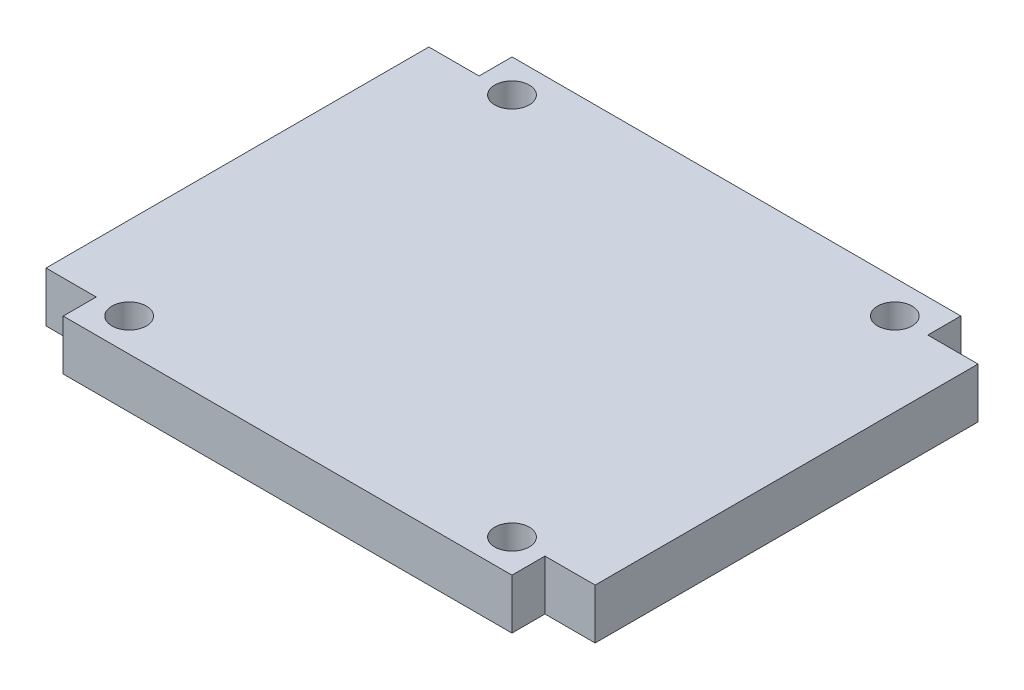
ISO-10303-21;
HEADER;
FILE_DESCRIPTION(('STEP AP214'),'2;1');
FILE_NAME('part.step','',(''),(''),'','','');
FILE_SCHEMA(('AUTOMOTIVE_DESIGN { 1 0 10303 214 1 1 1 1 }'));
ENDSEC;
DATA;
#1=APPLICATION_CONTEXT('core data for automotive mechanical design processes');
#2=APPLICATION_PROTOCOL_DEFINITION('international standard','automotive_design',2000,#1);
#3=PRODUCT_CONTEXT('',#1,'mechanical');
#4=PRODUCT('Part','Part','',(#3));
#5=PRODUCT_RELATED_PRODUCT_CATEGORY('part','',(#4));
#6=PRODUCT_DEFINITION_FORMATION('','',#4);
#7=PRODUCT_DEFINITION_CONTEXT('part definition',#1,'design');
#8=PRODUCT_DEFINITION('design','',#6,#7);
#9=PRODUCT_DEFINITION_SHAPE('','',#8);
#10=(LENGTH_UNIT() NAMED_UNIT(*) SI_UNIT(.MILLI.,.METRE.));
#11=(NAMED_UNIT(*) PLANE_ANGLE_UNIT() SI_UNIT($,.RADIAN.));
#12=(NAMED_UNIT(*) SI_UNIT($,.STERADIAN.) SOLID_ANGLE_UNIT());
#13=UNCERTAINTY_MEASURE_WITH_UNIT(LENGTH_MEASURE(1.E-05),#10,'distance_accuracy_value','');
#14=(GEOMETRIC_REPRESENTATION_CONTEXT(3) GLOBAL_UNCERTAINTY_ASSIGNED_CONTEXT((#13)) GLOBAL_UNIT_ASSIGNED_CONTEXT((#10,
#11,#12)) REPRESENTATION_CONTEXT('',''));
#15=CARTESIAN_POINT('',(0.,0.,0.));
#16=DIRECTION('',(0.,0.,1.));
#17=DIRECTION('',(1.,0.,0.));
#18=AXIS2_PLACEMENT_3D('',#15,#16,#17);
#19=CARTESIAN_POINT('',(21.875,4.,-15.25));
#20=DIRECTION('',(-1.,0.,0.));
#21=DIRECTION('',(0.,0.,1.));
#22=AXIS2_PLACEMENT_3D('',#19,#20,#21);
#23=PLANE('',#22);
#24=DIRECTION('',(0.,0.,-1.));
#25=VECTOR('',#24,1.);
#26=CARTESIAN_POINT('',(21.875,0.,-15.25));
#27=LINE('',#26,#25);
#28=CARTESIAN_POINT('',(21.875,0.,15.25));
#29=VERTEX_POINT('',#28);
#30=CARTESIAN_POINT('',(21.875,0.,-15.25));
#31=VERTEX_POINT('',#30);
#32=EDGE_CURVE('E163',#29,#31,#27,.T.);
#33=ORIENTED_EDGE('',*,*,#32,.T.);
#34=DIRECTION('',(0.,-1.,0.));
#35=VECTOR('',#34,1.);
#36=CARTESIAN_POINT('',(21.875,4.,-15.25));
#37=LINE('',#36,#35);
#38=CARTESIAN_POINT('',(21.875,4.,-15.25));
#39=VERTEX_POINT('',#38);
#40=EDGE_CURVE('E11',#39,#31,#37,.T.);
#41=ORIENTED_EDGE('',*,*,#40,.F.);
#42=DIRECTION('',(0.,0.,-1.));
#43=VECTOR('',#42,1.);
#44=CARTESIAN_POINT('',(21.875,4.,-15.25));
#45=LINE('',#44,#43);
#46=CARTESIAN_POINT('',(21.875,4.,15.25));
#47=VERTEX_POINT('',#46);
#48=EDGE_CURVE('E186',#47,#39,#45,.T.);
#49=ORIENTED_EDGE('',*,*,#48,.F.);
#50=DIRECTION('',(0.,-1.,0.));
#51=VECTOR('',#50,1.);
#52=CARTESIAN_POINT('',(21.875,4.,15.25));
#53=LINE('',#52,#51);
#54=EDGE_CURVE('E159',#47,#29,#53,.T.);
#55=ORIENTED_EDGE('',*,*,#54,.T.);
#56=EDGE_LOOP('',(#33,#41,#49,#55));
#57=FACE_BOUND('',#56,.T.);
#58=ADVANCED_FACE('F43',(#57),#23,.F.);
#59=CARTESIAN_POINT('',(17.875,4.,-15.25));
#60=DIRECTION('',(0.,0.,1.));
#61=DIRECTION('',(1.,0.,0.));
#62=AXIS2_PLACEMENT_3D('',#59,#60,#61);
#63=PLANE('',#62);
#64=DIRECTION('',(-1.,0.,0.));
#65=VECTOR('',#64,1.);
#66=CARTESIAN_POINT('',(17.875,0.,-15.25));
#67=LINE('',#66,#65);
#68=CARTESIAN_POINT('',(17.875,0.,-15.25));
#69=VERTEX_POINT('',#68);
#70=EDGE_CURVE('E166',#31,#69,#67,.T.);
#71=ORIENTED_EDGE('',*,*,#70,.T.);
#72=DIRECTION('',(0.,-1.,0.));
#73=VECTOR('',#72,1.);
#74=CARTESIAN_POINT('',(17.875,4.,-15.25));
#75=LINE('',#74,#73);
#76=CARTESIAN_POINT('',(17.875,4.,-15.25));
#77=VERTEX_POINT('',#76);
#78=EDGE_CURVE('E51',#77,#69,#75,.T.);
#79=ORIENTED_EDGE('',*,*,#78,.F.);
#80=DIRECTION('',(-1.,0.,0.));
#81=VECTOR('',#80,1.);
#82=CARTESIAN_POINT('',(17.875,4.,-15.25));
#83=LINE('',#82,#81);
#84=EDGE_CURVE('E114',#39,#77,#83,.T.);
#85=ORIENTED_EDGE('',*,*,#84,.F.);
#86=ORIENTED_EDGE('',*,*,#40,.T.);
#87=EDGE_LOOP('',(#71,#79,#85,#86));
#88=FACE_BOUND('',#87,.T.);
#89=ADVANCED_FACE('F265',(#88),#63,.F.);
#90=CARTESIAN_POINT('',(17.875,4.,-15.25));
#91=DIRECTION('',(-1.,0.,0.));
#92=DIRECTION('',(0.,0.,1.));
#93=AXIS2_PLACEMENT_3D('',#90,#91,#92);
#94=PLANE('',#93);
#95=DIRECTION('',(0.,0.,-1.));
#96=VECTOR('',#95,1.);
#97=CARTESIAN_POINT('',(17.875,0.,-15.25));
#98=LINE('',#97,#96);
#99=CARTESIAN_POINT('',(17.875,0.,-17.88));
#100=VERTEX_POINT('',#99);
#101=EDGE_CURVE('E169',#69,#100,#98,.T.);
#102=ORIENTED_EDGE('',*,*,#101,.T.);
#103=DIRECTION('',(0.,-1.,0.));
#104=VECTOR('',#103,1.);
#105=CARTESIAN_POINT('',(17.875,4.,-17.88));
#106=LINE('',#105,#104);
#107=CARTESIAN_POINT('',(17.875,4.,-17.88));
#108=VERTEX_POINT('',#107);
#109=EDGE_CURVE('E205',#108,#100,#106,.T.);
#110=ORIENTED_EDGE('',*,*,#109,.F.);
#111=DIRECTION('',(0.,0.,-1.));
#112=VECTOR('',#111,1.);
#113=CARTESIAN_POINT('',(17.875,4.,-15.25));
#114=LINE('',#113,#112);
#115=EDGE_CURVE('E213',#77,#108,#114,.T.);
#116=ORIENTED_EDGE('',*,*,#115,.F.);
#117=ORIENTED_EDGE('',*,*,#78,.T.);
#118=EDGE_LOOP('',(#102,#110,#116,#117));
#119=FACE_BOUND('',#118,.T.);
#120=ADVANCED_FACE('F211',(#119),#94,.F.);
#121=CARTESIAN_POINT('',(-17.875,4.,-17.88));
#122=DIRECTION('',(0.,0.,1.));
#123=DIRECTION('',(1.,0.,0.));
#124=AXIS2_PLACEMENT_3D('',#121,#122,#123);
#125=PLANE('',#124);
#126=DIRECTION('',(-1.,0.,0.));
#127=VECTOR('',#126,1.);
#128=CARTESIAN_POINT('',(-17.875,0.,-17.88));
#129=LINE('',#128,#127);
#130=CARTESIAN_POINT('',(-17.875,0.,-17.88));
#131=VERTEX_POINT('',#130);
#132=EDGE_CURVE('E171',#100,#131,#129,.T.);
#133=ORIENTED_EDGE('',*,*,#132,.T.);
#134=DIRECTION('',(0.,-1.,0.));
#135=VECTOR('',#134,1.);
#136=CARTESIAN_POINT('',(-17.875,4.,-17.88));
#137=LINE('',#136,#135);
#138=CARTESIAN_POINT('',(-17.875,4.,-17.88));
#139=VERTEX_POINT('',#138);
#140=EDGE_CURVE('E202',#139,#131,#137,.T.);
#141=ORIENTED_EDGE('',*,*,#140,.F.);
#142=DIRECTION('',(-1.,0.,0.));
#143=VECTOR('',#142,1.);
#144=CARTESIAN_POINT('',(-17.875,4.,-17.88));
#145=LINE('',#144,#143);
#146=EDGE_CURVE('E231',#108,#139,#145,.T.);
#147=ORIENTED_EDGE('',*,*,#146,.F.);
#148=ORIENTED_EDGE('',*,*,#109,.T.);
#149=EDGE_LOOP('',(#133,#141,#147,#148));
#150=FACE_BOUND('',#149,.T.);
#151=ADVANCED_FACE('F222',(#150),#125,.F.);
#152=CARTESIAN_POINT('',(-17.875,4.,-15.25));
#153=DIRECTION('',(1.,0.,0.));
#154=DIRECTION('',(0.,0.,-1.));
#155=AXIS2_PLACEMENT_3D('',#152,#153,#154);
#156=PLANE('',#155);
#157=DIRECTION('',(0.,0.,1.));
#158=VECTOR('',#157,1.);
#159=CARTESIAN_POINT('',(-17.875,0.,-15.25));
#160=LINE('',#159,#158);
#161=CARTESIAN_POINT('',(-17.875,0.,-15.25));
#162=VERTEX_POINT('',#161);
#163=EDGE_CURVE('E173',#131,#162,#160,.T.);
#164=ORIENTED_EDGE('',*,*,#163,.T.);
#165=DIRECTION('',(0.,-1.,0.));
#166=VECTOR('',#165,1.);
#167=CARTESIAN_POINT('',(-17.875,4.,-15.25));
#168=LINE('',#167,#166);
#169=CARTESIAN_POINT('',(-17.875,4.,-15.25));
#170=VERTEX_POINT('',#169);
#171=EDGE_CURVE('E199',#170,#162,#168,.T.);
#172=ORIENTED_EDGE('',*,*,#171,.F.);
#173=DIRECTION('',(0.,0.,1.));
#174=VECTOR('',#173,1.);
#175=CARTESIAN_POINT('',(-17.875,4.,-15.25));
#176=LINE('',#175,#174);
#177=EDGE_CURVE('E228',#139,#170,#176,.T.);
#178=ORIENTED_EDGE('',*,*,#177,.F.);
#179=ORIENTED_EDGE('',*,*,#140,.T.);
#180=EDGE_LOOP('',(#164,#172,#178,#179));
#181=FACE_BOUND('',#180,.T.);
#182=ADVANCED_FACE('F226',(#181),#156,.F.);
#183=CARTESIAN_POINT('',(-17.875,4.,-15.25));
#184=DIRECTION('',(0.,0.,1.));
#185=DIRECTION('',(1.,0.,0.));
#186=AXIS2_PLACEMENT_3D('',#183,#184,#185);
#187=PLANE('',#186);
#188=DIRECTION('',(-1.,0.,0.));
#189=VECTOR('',#188,1.);
#190=CARTESIAN_POINT('',(-17.875,0.,-15.25));
#191=LINE('',#190,#189);
#192=CARTESIAN_POINT('',(-21.875,0.,-15.25));
#193=VERTEX_POINT('',#192);
#194=EDGE_CURVE('E175',#162,#193,#191,.T.);
#195=ORIENTED_EDGE('',*,*,#194,.T.);
#196=DIRECTION('',(0.,-1.,0.));
#197=VECTOR('',#196,1.);
#198=CARTESIAN_POINT('',(-21.875,4.,-15.25));
#199=LINE('',#198,#197);
#200=CARTESIAN_POINT('',(-21.875,4.,-15.25));
#201=VERTEX_POINT('',#200);
#202=EDGE_CURVE('E196',#201,#193,#199,.T.);
#203=ORIENTED_EDGE('',*,*,#202,.F.);
#204=DIRECTION('',(-1.,0.,0.));
#205=VECTOR('',#204,1.);
#206=CARTESIAN_POINT('',(-17.875,4.,-15.25));
#207=LINE('',#206,#205);
#208=EDGE_CURVE('E230',#170,#201,#207,.T.);
#209=ORIENTED_EDGE('',*,*,#208,.F.);
#210=ORIENTED_EDGE('',*,*,#171,.T.);
#211=EDGE_LOOP('',(#195,#203,#209,#210));
#212=FACE_BOUND('',#211,.T.);
#213=ADVANCED_FACE('F278',(#212),#187,.F.);
#214=CARTESIAN_POINT('',(-21.875,4.,-15.25));
#215=DIRECTION('',(1.,0.,0.));
#216=DIRECTION('',(0.,0.,-1.));
#217=AXIS2_PLACEMENT_3D('',#214,#215,#216);
#218=PLANE('',#217);
#219=DIRECTION('',(0.,0.,1.));
#220=VECTOR('',#219,1.);
#221=CARTESIAN_POINT('',(-21.875,0.,-15.25));
#222=LINE('',#221,#220);
#223=CARTESIAN_POINT('',(-21.875,0.,15.25));
#224=VERTEX_POINT('',#223);
#225=EDGE_CURVE('E177',#193,#224,#222,.T.);
#226=ORIENTED_EDGE('',*,*,#225,.T.);
#227=DIRECTION('',(0.,-1.,0.));
#228=VECTOR('',#227,1.);
#229=CARTESIAN_POINT('',(-21.875,4.,15.25));
#230=LINE('',#229,#228);
#231=CARTESIAN_POINT('',(-21.875,4.,15.25));
#232=VERTEX_POINT('',#231);
#233=EDGE_CURVE('E193',#232,#224,#230,.T.);
#234=ORIENTED_EDGE('',*,*,#233,.F.);
#235=DIRECTION('',(0.,0.,1.));
#236=VECTOR('',#235,1.);
#237=CARTESIAN_POINT('',(-21.875,4.,-15.25));
#238=LINE('',#237,#236);
#239=EDGE_CURVE('E233',#201,#232,#238,.T.);
#240=ORIENTED_EDGE('',*,*,#239,.F.);
#241=ORIENTED_EDGE('',*,*,#202,.T.);
#242=EDGE_LOOP('',(#226,#234,#240,#241));
#243=FACE_BOUND('',#242,.T.);
#244=ADVANCED_FACE('F281',(#243),#218,.F.);
#245=CARTESIAN_POINT('',(-17.875,4.,15.25));
#246=DIRECTION('',(0.,0.,-1.));
#247=DIRECTION('',(-1.,0.,0.));
#248=AXIS2_PLACEMENT_3D('',#245,#246,#247);
#249=PLANE('',#248);
#250=DIRECTION('',(1.,0.,0.));
#251=VECTOR('',#250,1.);
#252=CARTESIAN_POINT('',(-17.875,0.,15.25));
#253=LINE('',#252,#251);
#254=CARTESIAN_POINT('',(-17.875,0.,15.25));
#255=VERTEX_POINT('',#254);
#256=EDGE_CURVE('E179',#224,#255,#253,.T.);
#257=ORIENTED_EDGE('',*,*,#256,.T.);
#258=DIRECTION('',(0.,-1.,0.));
#259=VECTOR('',#258,1.);
#260=CARTESIAN_POINT('',(-17.875,4.,15.25));
#261=LINE('',#260,#259);
#262=CARTESIAN_POINT('',(-17.875,4.,15.25));
#263=VERTEX_POINT('',#262);
#264=EDGE_CURVE('E190',#263,#255,#261,.T.);
#265=ORIENTED_EDGE('',*,*,#264,.F.);
#266=DIRECTION('',(1.,0.,0.));
#267=VECTOR('',#266,1.);
#268=CARTESIAN_POINT('',(-17.875,4.,15.25));
#269=LINE('',#268,#267);
#270=EDGE_CURVE('E239',#232,#263,#269,.T.);
#271=ORIENTED_EDGE('',*,*,#270,.F.);
#272=ORIENTED_EDGE('',*,*,#233,.T.);
#273=EDGE_LOOP('',(#257,#265,#271,#272));
#274=FACE_BOUND('',#273,.T.);
#275=ADVANCED_FACE('F245',(#274),#249,.F.);
#276=CARTESIAN_POINT('',(-17.875,4.,17.88));
#277=DIRECTION('',(1.,0.,0.));
#278=DIRECTION('',(0.,0.,-1.));
#279=AXIS2_PLACEMENT_3D('',#276,#277,#278);
#280=PLANE('',#279);
#281=DIRECTION('',(0.,0.,1.));
#282=VECTOR('',#281,1.);
#283=CARTESIAN_POINT('',(-17.875,0.,17.88));
#284=LINE('',#283,#282);
#285=CARTESIAN_POINT('',(-17.875,0.,17.88));
#286=VERTEX_POINT('',#285);
#287=EDGE_CURVE('E181',#255,#286,#284,.T.);
#288=ORIENTED_EDGE('',*,*,#287,.T.);
#289=DIRECTION('',(0.,-1.,0.));
#290=VECTOR('',#289,1.);
#291=CARTESIAN_POINT('',(-17.875,4.,17.88));
#292=LINE('',#291,#290);
#293=CARTESIAN_POINT('',(-17.875,4.,17.88));
#294=VERTEX_POINT('',#293);
#295=EDGE_CURVE('E154',#294,#286,#292,.T.);
#296=ORIENTED_EDGE('',*,*,#295,.F.);
#297=DIRECTION('',(0.,0.,1.));
#298=VECTOR('',#297,1.);
#299=CARTESIAN_POINT('',(-17.875,4.,17.88));
#300=LINE('',#299,#298);
#301=EDGE_CURVE('E145',#263,#294,#300,.T.);
#302=ORIENTED_EDGE('',*,*,#301,.F.);
#303=ORIENTED_EDGE('',*,*,#264,.T.);
#304=EDGE_LOOP('',(#288,#296,#302,#303));
#305=FACE_BOUND('',#304,.T.);
#306=ADVANCED_FACE('F249',(#305),#280,.F.);
#307=CARTESIAN_POINT('',(-17.875,4.,17.88));
#308=DIRECTION('',(0.,0.,-1.));
#309=DIRECTION('',(-1.,0.,0.));
#310=AXIS2_PLACEMENT_3D('',#307,#308,#309);
#311=PLANE('',#310);
#312=DIRECTION('',(1.,0.,0.));
#313=VECTOR('',#312,1.);
#314=CARTESIAN_POINT('',(-17.875,0.,17.88));
#315=LINE('',#314,#313);
#316=CARTESIAN_POINT('',(17.875,0.,17.88));
#317=VERTEX_POINT('',#316);
#318=EDGE_CURVE('E153',#286,#317,#315,.T.);
#319=ORIENTED_EDGE('',*,*,#318,.T.);
#320=DIRECTION('',(0.,-1.,0.));
#321=VECTOR('',#320,1.);
#322=CARTESIAN_POINT('',(17.875,4.,17.88));
#323=LINE('',#322,#321);
#324=CARTESIAN_POINT('',(17.875,4.,17.88));
#325=VERTEX_POINT('',#324);
#326=EDGE_CURVE('E150',#325,#317,#323,.T.);
#327=ORIENTED_EDGE('',*,*,#326,.F.);
#328=DIRECTION('',(1.,0.,0.));
#329=VECTOR('',#328,1.);
#330=CARTESIAN_POINT('',(-17.875,4.,17.88));
#331=LINE('',#330,#329);
#332=EDGE_CURVE('E139',#294,#325,#331,.T.);
#333=ORIENTED_EDGE('',*,*,#332,.F.);
#334=ORIENTED_EDGE('',*,*,#295,.T.);
#335=EDGE_LOOP('',(#319,#327,#333,#334));
#336=FACE_BOUND('',#335,.T.);
#337=ADVANCED_FACE('F151',(#336),#311,.F.);
#338=CARTESIAN_POINT('',(17.875,4.,17.88));
#339=DIRECTION('',(-1.,0.,0.));
#340=DIRECTION('',(0.,0.,1.));
#341=AXIS2_PLACEMENT_3D('',#338,#339,#340);
#342=PLANE('',#341);
#343=DIRECTION('',(0.,0.,-1.));
#344=VECTOR('',#343,1.);
#345=CARTESIAN_POINT('',(17.875,0.,17.88));
#346=LINE('',#345,#344);
#347=CARTESIAN_POINT('',(17.875,0.,15.25));
#348=VERTEX_POINT('',#347);
#349=EDGE_CURVE('E100',#317,#348,#346,.T.);
#350=ORIENTED_EDGE('',*,*,#349,.T.);
#351=DIRECTION('',(0.,-1.,0.));
#352=VECTOR('',#351,1.);
#353=CARTESIAN_POINT('',(17.875,4.,15.25));
#354=LINE('',#353,#352);
#355=CARTESIAN_POINT('',(17.875,4.,15.25));
#356=VERTEX_POINT('',#355);
#357=EDGE_CURVE('E155',#356,#348,#354,.T.);
#358=ORIENTED_EDGE('',*,*,#357,.F.);
#359=DIRECTION('',(0.,0.,-1.));
#360=VECTOR('',#359,1.);
#361=CARTESIAN_POINT('',(17.875,4.,17.88));
#362=LINE('',#361,#360);
#363=EDGE_CURVE('E143',#325,#356,#362,.T.);
#364=ORIENTED_EDGE('',*,*,#363,.F.);
#365=ORIENTED_EDGE('',*,*,#326,.T.);
#366=EDGE_LOOP('',(#350,#358,#364,#365));
#367=FACE_BOUND('',#366,.T.);
#368=ADVANCED_FACE('F157',(#367),#342,.F.);
#369=CARTESIAN_POINT('',(17.875,4.,15.25));
#370=DIRECTION('',(0.,0.,-1.));
#371=DIRECTION('',(-1.,0.,0.));
#372=AXIS2_PLACEMENT_3D('',#369,#370,#371);
#373=PLANE('',#372);
#374=DIRECTION('',(1.,0.,0.));
#375=VECTOR('',#374,1.);
#376=CARTESIAN_POINT('',(17.875,0.,15.25));
#377=LINE('',#376,#375);
#378=EDGE_CURVE('E106',#348,#29,#377,.T.);
#379=ORIENTED_EDGE('',*,*,#378,.T.);
#380=ORIENTED_EDGE('',*,*,#54,.F.);
#381=DIRECTION('',(1.,0.,0.));
#382=VECTOR('',#381,1.);
#383=CARTESIAN_POINT('',(17.875,4.,15.25));
#384=LINE('',#383,#382);
#385=EDGE_CURVE('E59',#356,#47,#384,.T.);
#386=ORIENTED_EDGE('',*,*,#385,.F.);
#387=ORIENTED_EDGE('',*,*,#357,.T.);
#388=EDGE_LOOP('',(#379,#380,#386,#387));
#389=FACE_BOUND('',#388,.T.);
#390=ADVANCED_FACE('F253',(#389),#373,.F.);
#391=CARTESIAN_POINT('',(0.,4.,0.));
#392=DIRECTION('',(0.,1.,0.));
#393=DIRECTION('',(0.,0.,1.));
#394=AXIS2_PLACEMENT_3D('',#391,#392,#393);
#395=PLANE('',#394);
#396=CARTESIAN_POINT('',(-15.25,4.,15.25));
#397=DIRECTION('',(0.,1.,0.));
#398=DIRECTION('',(0.,0.,1.));
#399=AXIS2_PLACEMENT_3D('',#396,#397,#398);
#400=CIRCLE('',#399,1.375);
#401=CARTESIAN_POINT('',(-15.25,4.,16.625));
#402=VERTEX_POINT('',#401);
#403=EDGE_CURVE('E365',#402,#402,#400,.T.);
#404=ORIENTED_EDGE('',*,*,#403,.F.);
#405=EDGE_LOOP('',(#404));
#406=FACE_BOUND('',#405,.T.);
#407=CARTESIAN_POINT('',(15.25,4.,15.25));
#408=DIRECTION('',(0.,1.,0.));
#409=DIRECTION('',(0.,0.,1.));
#410=AXIS2_PLACEMENT_3D('',#407,#408,#409);
#411=CIRCLE('',#410,1.375);
#412=CARTESIAN_POINT('',(15.25,4.,16.625));
#413=VERTEX_POINT('',#412);
#414=EDGE_CURVE('E369',#413,#413,#411,.T.);
#415=ORIENTED_EDGE('',*,*,#414,.F.);
#416=EDGE_LOOP('',(#415));
#417=FACE_BOUND('',#416,.T.);
#418=CARTESIAN_POINT('',(15.25,4.,-15.25));
#419=DIRECTION('',(0.,1.,0.));
#420=DIRECTION('',(0.,0.,1.));
#421=AXIS2_PLACEMENT_3D('',#418,#419,#420);
#422=CIRCLE('',#421,1.375);
#423=CARTESIAN_POINT('',(15.25,4.,-13.875));
#424=VERTEX_POINT('',#423);
#425=EDGE_CURVE('E387',#424,#424,#422,.T.);
#426=ORIENTED_EDGE('',*,*,#425,.F.);
#427=EDGE_LOOP('',(#426));
#428=FACE_BOUND('',#427,.T.);
#429=CARTESIAN_POINT('',(-15.25,4.,-15.25));
#430=DIRECTION('',(0.,1.,0.));
#431=DIRECTION('',(0.,0.,1.));
#432=AXIS2_PLACEMENT_3D('',#429,#430,#431);
#433=CIRCLE('',#432,1.375);
#434=CARTESIAN_POINT('',(-15.25,4.,-13.875));
#435=VERTEX_POINT('',#434);
#436=EDGE_CURVE('E167',#435,#435,#433,.T.);
#437=ORIENTED_EDGE('',*,*,#436,.F.);
#438=EDGE_LOOP('',(#437));
#439=FACE_BOUND('',#438,.T.);
#440=ORIENTED_EDGE('',*,*,#48,.T.);
#441=ORIENTED_EDGE('',*,*,#84,.T.);
#442=ORIENTED_EDGE('',*,*,#115,.T.);
#443=ORIENTED_EDGE('',*,*,#146,.T.);
#444=ORIENTED_EDGE('',*,*,#177,.T.);
#445=ORIENTED_EDGE('',*,*,#208,.T.);
#446=ORIENTED_EDGE('',*,*,#239,.T.);
#447=ORIENTED_EDGE('',*,*,#270,.T.);
#448=ORIENTED_EDGE('',*,*,#301,.T.);
#449=ORIENTED_EDGE('',*,*,#332,.T.);
#450=ORIENTED_EDGE('',*,*,#363,.T.);
#451=ORIENTED_EDGE('',*,*,#385,.T.);
#452=EDGE_LOOP('',(#440,#441,#442,#443,#444,#445,#446,#447,#448,#449,#450,#451));
#453=FACE_BOUND('',#452,.T.);
#454=ADVANCED_FACE('F141',(#406,#417,#428,#439,#453),#395,.T.);
#455=CARTESIAN_POINT('',(0.,0.,0.));
#456=DIRECTION('',(0.,1.,0.));
#457=DIRECTION('',(0.,0.,1.));
#458=AXIS2_PLACEMENT_3D('',#455,#456,#457);
#459=PLANE('',#458);
#460=CARTESIAN_POINT('',(-15.25,0.,15.25));
#461=DIRECTION('',(0.,1.,0.));
#462=DIRECTION('',(0.,0.,1.));
#463=AXIS2_PLACEMENT_3D('',#460,#461,#462);
#464=CIRCLE('',#463,1.375);
#465=CARTESIAN_POINT('',(-15.25,0.,16.625));
#466=VERTEX_POINT('',#465);
#467=EDGE_CURVE('E368',#466,#466,#464,.T.);
#468=ORIENTED_EDGE('',*,*,#467,.T.);
#469=EDGE_LOOP('',(#468));
#470=FACE_BOUND('',#469,.T.);
#471=CARTESIAN_POINT('',(15.25,0.,15.25));
#472=DIRECTION('',(0.,1.,0.));
#473=DIRECTION('',(0.,0.,1.));
#474=AXIS2_PLACEMENT_3D('',#471,#472,#473);
#475=CIRCLE('',#474,1.375);
#476=CARTESIAN_POINT('',(15.25,0.,16.625));
#477=VERTEX_POINT('',#476);
#478=EDGE_CURVE('E372',#477,#477,#475,.T.);
#479=ORIENTED_EDGE('',*,*,#478,.T.);
#480=EDGE_LOOP('',(#479));
#481=FACE_BOUND('',#480,.T.);
#482=CARTESIAN_POINT('',(15.25,0.,-15.25));
#483=DIRECTION('',(0.,1.,0.));
#484=DIRECTION('',(0.,0.,1.));
#485=AXIS2_PLACEMENT_3D('',#482,#483,#484);
#486=CIRCLE('',#485,1.375);
#487=CARTESIAN_POINT('',(15.25,0.,-13.875));
#488=VERTEX_POINT('',#487);
#489=EDGE_CURVE('E382',#488,#488,#486,.T.);
#490=ORIENTED_EDGE('',*,*,#489,.T.);
#491=EDGE_LOOP('',(#490));
#492=FACE_BOUND('',#491,.T.);
#493=CARTESIAN_POINT('',(-15.25,0.,-15.25));
#494=DIRECTION('',(0.,1.,0.));
#495=DIRECTION('',(0.,0.,1.));
#496=AXIS2_PLACEMENT_3D('',#493,#494,#495);
#497=CIRCLE('',#496,1.375);
#498=CARTESIAN_POINT('',(-15.25,0.,-13.875));
#499=VERTEX_POINT('',#498);
#500=EDGE_CURVE('E379',#499,#499,#497,.T.);
#501=ORIENTED_EDGE('',*,*,#500,.T.);
#502=EDGE_LOOP('',(#501));
#503=FACE_BOUND('',#502,.T.);
#504=ORIENTED_EDGE('',*,*,#32,.F.);
#505=ORIENTED_EDGE('',*,*,#378,.F.);
#506=ORIENTED_EDGE('',*,*,#349,.F.);
#507=ORIENTED_EDGE('',*,*,#318,.F.);
#508=ORIENTED_EDGE('',*,*,#287,.F.);
#509=ORIENTED_EDGE('',*,*,#256,.F.);
#510=ORIENTED_EDGE('',*,*,#225,.F.);
#511=ORIENTED_EDGE('',*,*,#194,.F.);
#512=ORIENTED_EDGE('',*,*,#163,.F.);
#513=ORIENTED_EDGE('',*,*,#132,.F.);
#514=ORIENTED_EDGE('',*,*,#101,.F.);
#515=ORIENTED_EDGE('',*,*,#70,.F.);
#516=EDGE_LOOP('',(#504,#505,#506,#507,#508,#509,#510,#511,#512,#513,#514,#515));
#517=FACE_BOUND('',#516,.T.);
#518=ADVANCED_FACE('F217',(#470,#481,#492,#503,#517),#459,.F.);
#519=CARTESIAN_POINT('',(-15.25,4.,-15.25));
#520=DIRECTION('',(0.,-1.,0.));
#521=DIRECTION('',(0.,0.,-1.));
#522=AXIS2_PLACEMENT_3D('',#519,#520,#521);
#523=CYLINDRICAL_SURFACE('',#522,1.375);
#524=ORIENTED_EDGE('',*,*,#436,.T.);
#525=EDGE_LOOP('',(#524));
#526=FACE_BOUND('',#525,.T.);
#527=ORIENTED_EDGE('',*,*,#500,.F.);
#528=EDGE_LOOP('',(#527));
#529=FACE_BOUND('',#528,.T.);
#530=ADVANCED_FACE('F320',(#526,#529),#523,.F.);
#531=CARTESIAN_POINT('',(15.25,4.,-15.25));
#532=DIRECTION('',(0.,-1.,0.));
#533=DIRECTION('',(0.,0.,-1.));
#534=AXIS2_PLACEMENT_3D('',#531,#532,#533);
#535=CYLINDRICAL_SURFACE('',#534,1.375);
#536=ORIENTED_EDGE('',*,*,#425,.T.);
#537=EDGE_LOOP('',(#536));
#538=FACE_BOUND('',#537,.T.);
#539=ORIENTED_EDGE('',*,*,#489,.F.);
#540=EDGE_LOOP('',(#539));
#541=FACE_BOUND('',#540,.T.);
#542=ADVANCED_FACE('F329',(#538,#541),#535,.F.);
#543=CARTESIAN_POINT('',(15.25,4.,15.25));
#544=DIRECTION('',(0.,-1.,0.));
#545=DIRECTION('',(0.,0.,-1.));
#546=AXIS2_PLACEMENT_3D('',#543,#544,#545);
#547=CYLINDRICAL_SURFACE('',#546,1.375);
#548=ORIENTED_EDGE('',*,*,#414,.T.);
#549=EDGE_LOOP('',(#548));
#550=FACE_BOUND('',#549,.T.);
#551=ORIENTED_EDGE('',*,*,#478,.F.);
#552=EDGE_LOOP('',(#551));
#553=FACE_BOUND('',#552,.T.);
#554=ADVANCED_FACE('F339',(#550,#553),#547,.F.);
#555=CARTESIAN_POINT('',(-15.25,4.,15.25));
#556=DIRECTION('',(0.,-1.,0.));
#557=DIRECTION('',(0.,0.,-1.));
#558=AXIS2_PLACEMENT_3D('',#555,#556,#557);
#559=CYLINDRICAL_SURFACE('',#558,1.375);
#560=ORIENTED_EDGE('',*,*,#403,.T.);
#561=EDGE_LOOP('',(#560));
#562=FACE_BOUND('',#561,.T.);
#563=ORIENTED_EDGE('',*,*,#467,.F.);
#564=EDGE_LOOP('',(#563));
#565=FACE_BOUND('',#564,.T.);
#566=ADVANCED_FACE('F349',(#562,#565),#559,.F.);
#567=CLOSED_SHELL('',(#58,#89,#120,#151,#182,#213,#244,#275,#306,#337,#368,#390,#454,#518,#530,
#542,#554,#566));
#568=MANIFOLD_SOLID_BREP('B2',#567);
#569=ADVANCED_BREP_SHAPE_REPRESENTATION('',(#18,#568),#14);
#570=SHAPE_DEFINITION_REPRESENTATION(#9,#569);
ENDSEC;
END-ISO-10303-21;
